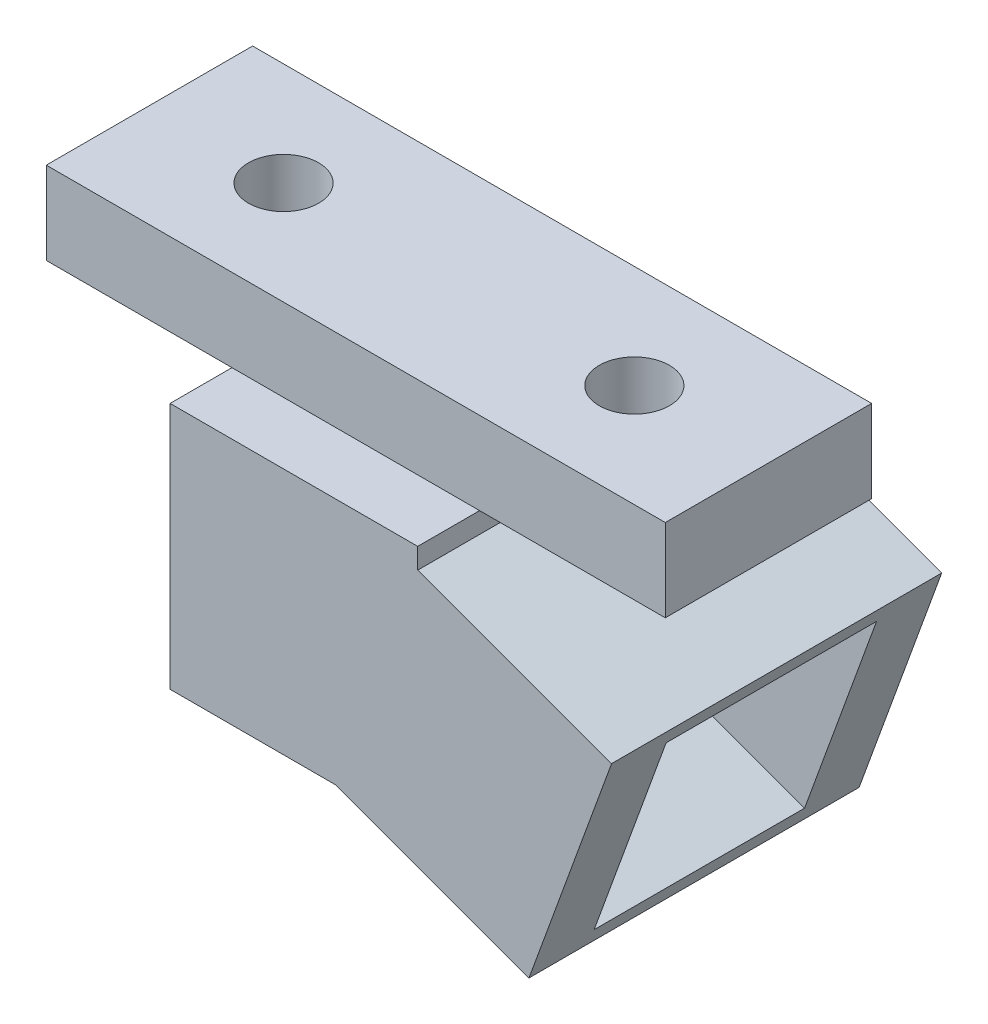
ISO-10303-21;
HEADER;
FILE_DESCRIPTION(('STEP AP214'),'2;1');
FILE_NAME('part.step','',(''),(''),'','','');
FILE_SCHEMA(('AUTOMOTIVE_DESIGN { 1 0 10303 214 1 1 1 1 }'));
ENDSEC;
DATA;
#1=APPLICATION_CONTEXT('core data for automotive mechanical design processes');
#2=APPLICATION_PROTOCOL_DEFINITION('international standard','automotive_design',2000,#1);
#3=PRODUCT_CONTEXT('',#1,'mechanical');
#4=PRODUCT('Part','Part','',(#3));
#5=PRODUCT_RELATED_PRODUCT_CATEGORY('part','',(#4));
#6=PRODUCT_DEFINITION_FORMATION('','',#4);
#7=PRODUCT_DEFINITION_CONTEXT('part definition',#1,'design');
#8=PRODUCT_DEFINITION('design','',#6,#7);
#9=PRODUCT_DEFINITION_SHAPE('','',#8);
#10=(LENGTH_UNIT() NAMED_UNIT(*) SI_UNIT(.MILLI.,.METRE.));
#11=(NAMED_UNIT(*) PLANE_ANGLE_UNIT() SI_UNIT($,.RADIAN.));
#12=(NAMED_UNIT(*) SI_UNIT($,.STERADIAN.) SOLID_ANGLE_UNIT());
#13=UNCERTAINTY_MEASURE_WITH_UNIT(LENGTH_MEASURE(1.E-05),#10,'distance_accuracy_value','');
#14=(GEOMETRIC_REPRESENTATION_CONTEXT(3) GLOBAL_UNCERTAINTY_ASSIGNED_CONTEXT((#13)) GLOBAL_UNIT_ASSIGNED_CONTEXT((#10,
#11,#12)) REPRESENTATION_CONTEXT('',''));
#15=CARTESIAN_POINT('',(0.,0.,0.));
#16=DIRECTION('',(0.,0.,1.));
#17=DIRECTION('',(1.,0.,0.));
#18=AXIS2_PLACEMENT_3D('',#15,#16,#17);
#19=CARTESIAN_POINT('',(0.,0.,0.));
#20=DIRECTION('',(0.,1.,0.));
#21=DIRECTION('',(0.,0.,1.));
#22=AXIS2_PLACEMENT_3D('',#19,#20,#21);
#23=PLANE('',#22);
#24=CARTESIAN_POINT('',(3.25,0.,-2.5));
#25=DIRECTION('',(0.,1.,0.));
#26=DIRECTION('',(0.,0.,1.));
#27=AXIS2_PLACEMENT_3D('',#24,#25,#26);
#28=CIRCLE('',#27,0.85);
#29=CARTESIAN_POINT('',(3.25,0.,-1.65));
#30=VERTEX_POINT('',#29);
#31=EDGE_CURVE('E332',#30,#30,#28,.T.);
#32=ORIENTED_EDGE('',*,*,#31,.T.);
#33=EDGE_LOOP('',(#32));
#34=FACE_BOUND('',#33,.T.);
#35=DIRECTION('',(0.,0.,-1.));
#36=VECTOR('',#35,1.);
#37=CARTESIAN_POINT('',(4.5,0.,1.5));
#38=LINE('',#37,#36);
#39=CARTESIAN_POINT('',(4.5,0.,0.));
#40=VERTEX_POINT('',#39);
#41=CARTESIAN_POINT('',(4.5,0.,-5.));
#42=VERTEX_POINT('',#41);
#43=EDGE_CURVE('E12',#40,#42,#38,.T.);
#44=ORIENTED_EDGE('',*,*,#43,.F.);
#45=DIRECTION('',(1.,0.,0.));
#46=VECTOR('',#45,1.);
#47=CARTESIAN_POINT('',(0.,0.,0.));
#48=LINE('',#47,#46);
#49=CARTESIAN_POINT('',(0.,0.,0.));
#50=VERTEX_POINT('',#49);
#51=EDGE_CURVE('E368',#50,#40,#48,.T.);
#52=ORIENTED_EDGE('',*,*,#51,.F.);
#53=DIRECTION('',(0.,0.,-1.));
#54=VECTOR('',#53,1.);
#55=CARTESIAN_POINT('',(0.,0.,0.));
#56=LINE('',#55,#54);
#57=CARTESIAN_POINT('',(0.,0.,-5.));
#58=VERTEX_POINT('',#57);
#59=EDGE_CURVE('E349',#50,#58,#56,.T.);
#60=ORIENTED_EDGE('',*,*,#59,.T.);
#61=DIRECTION('',(1.,0.,0.));
#62=VECTOR('',#61,1.);
#63=CARTESIAN_POINT('',(0.,0.,-5.));
#64=LINE('',#63,#62);
#65=EDGE_CURVE('E359',#58,#42,#64,.T.);
#66=ORIENTED_EDGE('',*,*,#65,.T.);
#67=EDGE_LOOP('',(#44,#52,#60,#66));
#68=FACE_BOUND('',#67,.T.);
#69=ADVANCED_FACE('F77',(#34,#68),#23,.F.);
#70=CARTESIAN_POINT('',(11.75,0.,-2.5));
#71=DIRECTION('',(0.,-1.,0.));
#72=DIRECTION('',(0.,0.,-1.));
#73=AXIS2_PLACEMENT_3D('',#70,#71,#72);
#74=CIRCLE('',#73,0.85);
#75=CARTESIAN_POINT('',(11.75,0.,-3.35));
#76=VERTEX_POINT('',#75);
#77=EDGE_CURVE('E327',#76,#76,#74,.T.);
#78=ORIENTED_EDGE('',*,*,#77,.F.);
#79=EDGE_LOOP('',(#78));
#80=FACE_BOUND('',#79,.T.);
#81=DIRECTION('',(0.,0.,1.));
#82=VECTOR('',#81,1.);
#83=CARTESIAN_POINT('',(10.5,0.,1.5));
#84=LINE('',#83,#82);
#85=CARTESIAN_POINT('',(10.5,0.,-5.));
#86=VERTEX_POINT('',#85);
#87=CARTESIAN_POINT('',(10.5,0.,0.));
#88=VERTEX_POINT('',#87);
#89=EDGE_CURVE('E87',#86,#88,#84,.T.);
#90=ORIENTED_EDGE('',*,*,#89,.F.);
#91=CARTESIAN_POINT('',(15.,0.,-5.));
#92=VERTEX_POINT('',#91);
#93=EDGE_CURVE('E340',#86,#92,#64,.T.);
#94=ORIENTED_EDGE('',*,*,#93,.T.);
#95=DIRECTION('',(0.,0.,-1.));
#96=VECTOR('',#95,1.);
#97=CARTESIAN_POINT('',(15.,0.,0.));
#98=LINE('',#97,#96);
#99=CARTESIAN_POINT('',(15.,0.,0.));
#100=VERTEX_POINT('',#99);
#101=EDGE_CURVE('E362',#100,#92,#98,.T.);
#102=ORIENTED_EDGE('',*,*,#101,.F.);
#103=EDGE_CURVE('E367',#88,#100,#48,.T.);
#104=ORIENTED_EDGE('',*,*,#103,.F.);
#105=EDGE_LOOP('',(#90,#94,#102,#104));
#106=FACE_BOUND('',#105,.T.);
#107=ADVANCED_FACE('F395',(#80,#106),#23,.F.);
#108=CARTESIAN_POINT('',(0.,2.,0.));
#109=DIRECTION('',(0.,1.,0.));
#110=DIRECTION('',(0.,0.,1.));
#111=AXIS2_PLACEMENT_3D('',#108,#109,#110);
#112=PLANE('',#111);
#113=CARTESIAN_POINT('',(11.75,2.,-2.5));
#114=DIRECTION('',(0.,-1.,0.));
#115=DIRECTION('',(0.,0.,-1.));
#116=AXIS2_PLACEMENT_3D('',#113,#114,#115);
#117=CIRCLE('',#116,0.85);
#118=CARTESIAN_POINT('',(11.75,2.,-3.35));
#119=VERTEX_POINT('',#118);
#120=EDGE_CURVE('E328',#119,#119,#117,.T.);
#121=ORIENTED_EDGE('',*,*,#120,.T.);
#122=EDGE_LOOP('',(#121));
#123=FACE_BOUND('',#122,.T.);
#124=DIRECTION('',(1.,0.,0.));
#125=VECTOR('',#124,1.);
#126=CARTESIAN_POINT('',(0.,2.,-5.));
#127=LINE('',#126,#125);
#128=CARTESIAN_POINT('',(0.,2.,-5.));
#129=VERTEX_POINT('',#128);
#130=CARTESIAN_POINT('',(15.,2.,-5.));
#131=VERTEX_POINT('',#130);
#132=EDGE_CURVE('E344',#129,#131,#127,.T.);
#133=ORIENTED_EDGE('',*,*,#132,.F.);
#134=DIRECTION('',(0.,0.,-1.));
#135=VECTOR('',#134,1.);
#136=CARTESIAN_POINT('',(0.,2.,0.));
#137=LINE('',#136,#135);
#138=CARTESIAN_POINT('',(0.,2.,0.));
#139=VERTEX_POINT('',#138);
#140=EDGE_CURVE('E355',#139,#129,#137,.T.);
#141=ORIENTED_EDGE('',*,*,#140,.F.);
#142=DIRECTION('',(1.,0.,0.));
#143=VECTOR('',#142,1.);
#144=CARTESIAN_POINT('',(0.,2.,0.));
#145=LINE('',#144,#143);
#146=CARTESIAN_POINT('',(15.,2.,0.));
#147=VERTEX_POINT('',#146);
#148=EDGE_CURVE('E352',#139,#147,#145,.T.);
#149=ORIENTED_EDGE('',*,*,#148,.T.);
#150=DIRECTION('',(0.,0.,-1.));
#151=VECTOR('',#150,1.);
#152=CARTESIAN_POINT('',(15.,2.,0.));
#153=LINE('',#152,#151);
#154=EDGE_CURVE('E348',#147,#131,#153,.T.);
#155=ORIENTED_EDGE('',*,*,#154,.T.);
#156=EDGE_LOOP('',(#133,#141,#149,#155));
#157=FACE_BOUND('',#156,.T.);
#158=CARTESIAN_POINT('',(3.25,2.,-2.5));
#159=DIRECTION('',(0.,1.,0.));
#160=DIRECTION('',(0.,0.,1.));
#161=AXIS2_PLACEMENT_3D('',#158,#159,#160);
#162=CIRCLE('',#161,0.85);
#163=CARTESIAN_POINT('',(3.25,2.,-1.65));
#164=VERTEX_POINT('',#163);
#165=EDGE_CURVE('E336',#164,#164,#162,.T.);
#166=ORIENTED_EDGE('',*,*,#165,.F.);
#167=EDGE_LOOP('',(#166));
#168=FACE_BOUND('',#167,.T.);
#169=ADVANCED_FACE('F460',(#123,#157,#168),#112,.T.);
#170=CARTESIAN_POINT('',(0.,2.,-5.));
#171=DIRECTION('',(0.,0.,-1.));
#172=DIRECTION('',(-1.,0.,0.));
#173=AXIS2_PLACEMENT_3D('',#170,#171,#172);
#174=PLANE('',#173);
#175=ORIENTED_EDGE('',*,*,#65,.F.);
#176=DIRECTION('',(0.,-1.,0.));
#177=VECTOR('',#176,1.);
#178=CARTESIAN_POINT('',(0.,2.,-5.));
#179=LINE('',#178,#177);
#180=EDGE_CURVE('E375',#129,#58,#179,.T.);
#181=ORIENTED_EDGE('',*,*,#180,.F.);
#182=ORIENTED_EDGE('',*,*,#132,.T.);
#183=DIRECTION('',(0.,-1.,0.));
#184=VECTOR('',#183,1.);
#185=CARTESIAN_POINT('',(15.,2.,-5.));
#186=LINE('',#185,#184);
#187=EDGE_CURVE('E81',#131,#92,#186,.T.);
#188=ORIENTED_EDGE('',*,*,#187,.T.);
#189=ORIENTED_EDGE('',*,*,#93,.F.);
#190=EDGE_CURVE('E363',#42,#86,#64,.T.);
#191=ORIENTED_EDGE('',*,*,#190,.F.);
#192=EDGE_LOOP('',(#175,#181,#182,#188,#189,#191));
#193=FACE_BOUND('',#192,.T.);
#194=ADVANCED_FACE('F79',(#193),#174,.T.);
#195=CARTESIAN_POINT('',(0.,2.,0.));
#196=DIRECTION('',(-1.,0.,0.));
#197=DIRECTION('',(0.,0.,1.));
#198=AXIS2_PLACEMENT_3D('',#195,#196,#197);
#199=PLANE('',#198);
#200=ORIENTED_EDGE('',*,*,#59,.F.);
#201=DIRECTION('',(0.,-1.,0.));
#202=VECTOR('',#201,1.);
#203=CARTESIAN_POINT('',(0.,2.,0.));
#204=LINE('',#203,#202);
#205=EDGE_CURVE('E378',#139,#50,#204,.T.);
#206=ORIENTED_EDGE('',*,*,#205,.F.);
#207=ORIENTED_EDGE('',*,*,#140,.T.);
#208=ORIENTED_EDGE('',*,*,#180,.T.);
#209=EDGE_LOOP('',(#200,#206,#207,#208));
#210=FACE_BOUND('',#209,.T.);
#211=ADVANCED_FACE('F465',(#210),#199,.T.);
#212=CARTESIAN_POINT('',(0.,2.,0.));
#213=DIRECTION('',(0.,0.,-1.));
#214=DIRECTION('',(-1.,0.,0.));
#215=AXIS2_PLACEMENT_3D('',#212,#213,#214);
#216=PLANE('',#215);
#217=ORIENTED_EDGE('',*,*,#51,.T.);
#218=EDGE_CURVE('E371',#40,#88,#48,.T.);
#219=ORIENTED_EDGE('',*,*,#218,.T.);
#220=ORIENTED_EDGE('',*,*,#103,.T.);
#221=DIRECTION('',(0.,-1.,0.));
#222=VECTOR('',#221,1.);
#223=CARTESIAN_POINT('',(15.,2.,0.));
#224=LINE('',#223,#222);
#225=EDGE_CURVE('E380',#147,#100,#224,.T.);
#226=ORIENTED_EDGE('',*,*,#225,.F.);
#227=ORIENTED_EDGE('',*,*,#148,.F.);
#228=ORIENTED_EDGE('',*,*,#205,.T.);
#229=EDGE_LOOP('',(#217,#219,#220,#226,#227,#228));
#230=FACE_BOUND('',#229,.T.);
#231=ADVANCED_FACE('F468',(#230),#216,.F.);
#232=CARTESIAN_POINT('',(15.,2.,0.));
#233=DIRECTION('',(-1.,0.,0.));
#234=DIRECTION('',(0.,0.,1.));
#235=AXIS2_PLACEMENT_3D('',#232,#233,#234);
#236=PLANE('',#235);
#237=ORIENTED_EDGE('',*,*,#101,.T.);
#238=ORIENTED_EDGE('',*,*,#187,.F.);
#239=ORIENTED_EDGE('',*,*,#154,.F.);
#240=ORIENTED_EDGE('',*,*,#225,.T.);
#241=EDGE_LOOP('',(#237,#238,#239,#240));
#242=FACE_BOUND('',#241,.T.);
#243=ADVANCED_FACE('F394',(#242),#236,.F.);
#244=CARTESIAN_POINT('',(3.25,2.,-2.5));
#245=DIRECTION('',(0.,-1.,0.));
#246=DIRECTION('',(0.,0.,-1.));
#247=AXIS2_PLACEMENT_3D('',#244,#245,#246);
#248=CYLINDRICAL_SURFACE('',#247,0.85);
#249=ORIENTED_EDGE('',*,*,#165,.T.);
#250=EDGE_LOOP('',(#249));
#251=FACE_BOUND('',#250,.T.);
#252=ORIENTED_EDGE('',*,*,#31,.F.);
#253=EDGE_LOOP('',(#252));
#254=FACE_BOUND('',#253,.T.);
#255=ADVANCED_FACE('F473',(#251,#254),#248,.F.);
#256=CARTESIAN_POINT('',(11.75,2.,-2.5));
#257=DIRECTION('',(0.,-1.,0.));
#258=DIRECTION('',(0.,0.,-1.));
#259=AXIS2_PLACEMENT_3D('',#256,#257,#258);
#260=CYLINDRICAL_SURFACE('',#259,0.85);
#261=ORIENTED_EDGE('',*,*,#120,.F.);
#262=EDGE_LOOP('',(#261));
#263=FACE_BOUND('',#262,.T.);
#264=ORIENTED_EDGE('',*,*,#77,.T.);
#265=EDGE_LOOP('',(#264));
#266=FACE_BOUND('',#265,.T.);
#267=ADVANCED_FACE('F477',(#263,#266),#260,.F.);
#268=CARTESIAN_POINT('',(0.,0.,0.));
#269=DIRECTION('',(0.,-1.,0.));
#270=DIRECTION('',(0.,0.,-1.));
#271=AXIS2_PLACEMENT_3D('',#268,#269,#270);
#272=PLANE('',#271);
#273=CARTESIAN_POINT('',(4.5,0.,-6.5));
#274=VERTEX_POINT('',#273);
#275=EDGE_CURVE('E90',#42,#274,#38,.T.);
#276=ORIENTED_EDGE('',*,*,#275,.F.);
#277=ORIENTED_EDGE('',*,*,#190,.T.);
#278=CARTESIAN_POINT('',(10.5,0.,-6.5));
#279=VERTEX_POINT('',#278);
#280=EDGE_CURVE('E305',#279,#86,#84,.T.);
#281=ORIENTED_EDGE('',*,*,#280,.F.);
#282=DIRECTION('',(1.,0.,0.));
#283=VECTOR('',#282,1.);
#284=CARTESIAN_POINT('',(10.5,0.,-6.5));
#285=LINE('',#284,#283);
#286=EDGE_CURVE('E286',#274,#279,#285,.T.);
#287=ORIENTED_EDGE('',*,*,#286,.F.);
#288=EDGE_LOOP('',(#276,#277,#281,#287));
#289=FACE_BOUND('',#288,.T.);
#290=ADVANCED_FACE('F402',(#289),#272,.F.);
#291=CARTESIAN_POINT('',(10.5,-6.,-6.5));
#292=DIRECTION('',(0.,0.,1.));
#293=DIRECTION('',(1.,0.,0.));
#294=AXIS2_PLACEMENT_3D('',#291,#292,#293);
#295=PLANE('',#294);
#296=DIRECTION('',(0.,1.,0.));
#297=VECTOR('',#296,1.);
#298=CARTESIAN_POINT('',(10.5,-6.,-6.5));
#299=LINE('',#298,#297);
#300=CARTESIAN_POINT('',(10.5,-0.5,-6.5));
#301=VERTEX_POINT('',#300);
#302=EDGE_CURVE('E324',#301,#279,#299,.T.);
#303=ORIENTED_EDGE('',*,*,#302,.F.);
#304=DIRECTION('',(-0.93969262078591,0.342020143325663,0.));
#305=VECTOR('',#304,1.);
#306=CARTESIAN_POINT('',(15.1984631039296,-2.21010071662832,-6.5));
#307=LINE('',#306,#305);
#308=CARTESIAN_POINT('',(15.1984631039296,-2.21010071662832,-6.5));
#309=VERTEX_POINT('',#308);
#310=EDGE_CURVE('E253',#309,#301,#307,.T.);
#311=ORIENTED_EDGE('',*,*,#310,.F.);
#312=DIRECTION('',(0.342020143325663,0.939692620785911,0.));
#313=VECTOR('',#312,1.);
#314=CARTESIAN_POINT('',(15.1984631039296,-2.21010071662832,-6.5));
#315=LINE('',#314,#313);
#316=CARTESIAN_POINT('',(13.1966268154655,-7.71010071662832,-6.5));
#317=VERTEX_POINT('',#316);
#318=EDGE_CURVE('E243',#317,#309,#315,.T.);
#319=ORIENTED_EDGE('',*,*,#318,.F.);
#320=DIRECTION('',(-0.93969262078591,0.342020143325663,0.));
#321=VECTOR('',#320,1.);
#322=CARTESIAN_POINT('',(13.1966268154655,-7.71010071662832,-6.5));
#323=LINE('',#322,#321);
#324=CARTESIAN_POINT('',(8.49816371153593,-6.,-6.5));
#325=VERTEX_POINT('',#324);
#326=EDGE_CURVE('E256',#317,#325,#323,.T.);
#327=ORIENTED_EDGE('',*,*,#326,.T.);
#328=DIRECTION('',(1.,0.,0.));
#329=VECTOR('',#328,1.);
#330=CARTESIAN_POINT('',(10.5,-6.,-6.5));
#331=LINE('',#330,#329);
#332=CARTESIAN_POINT('',(4.5,-6.,-6.5));
#333=VERTEX_POINT('',#332);
#334=EDGE_CURVE('E290',#333,#325,#331,.T.);
#335=ORIENTED_EDGE('',*,*,#334,.F.);
#336=DIRECTION('',(0.,1.,0.));
#337=VECTOR('',#336,1.);
#338=CARTESIAN_POINT('',(4.5,-6.,-6.5));
#339=LINE('',#338,#337);
#340=EDGE_CURVE('E300',#333,#274,#339,.T.);
#341=ORIENTED_EDGE('',*,*,#340,.T.);
#342=ORIENTED_EDGE('',*,*,#286,.T.);
#343=EDGE_LOOP('',(#303,#311,#319,#327,#335,#341,#342));
#344=FACE_BOUND('',#343,.T.);
#345=ADVANCED_FACE('F411',(#344),#295,.F.);
#346=CARTESIAN_POINT('',(10.5,-6.,1.5));
#347=DIRECTION('',(-1.,0.,0.));
#348=DIRECTION('',(0.,0.,1.));
#349=AXIS2_PLACEMENT_3D('',#346,#347,#348);
#350=PLANE('',#349);
#351=DIRECTION('',(0.,1.,0.));
#352=VECTOR('',#351,1.);
#353=CARTESIAN_POINT('',(10.5,-6.,1.5));
#354=LINE('',#353,#352);
#355=CARTESIAN_POINT('',(10.5,-0.500000000000003,1.5));
#356=VERTEX_POINT('',#355);
#357=CARTESIAN_POINT('',(10.5,0.,1.5));
#358=VERTEX_POINT('',#357);
#359=EDGE_CURVE('E321',#356,#358,#354,.T.);
#360=ORIENTED_EDGE('',*,*,#359,.F.);
#361=DIRECTION('',(0.,0.,-1.));
#362=VECTOR('',#361,1.);
#363=CARTESIAN_POINT('',(10.5,-0.5,7.3529777486175));
#364=LINE('',#363,#362);
#365=EDGE_CURVE('E277',#356,#301,#364,.T.);
#366=ORIENTED_EDGE('',*,*,#365,.T.);
#367=ORIENTED_EDGE('',*,*,#302,.T.);
#368=ORIENTED_EDGE('',*,*,#280,.T.);
#369=ORIENTED_EDGE('',*,*,#89,.T.);
#370=EDGE_CURVE('E304',#88,#358,#84,.T.);
#371=ORIENTED_EDGE('',*,*,#370,.T.);
#372=EDGE_LOOP('',(#360,#366,#367,#368,#369,#371));
#373=FACE_BOUND('',#372,.T.);
#374=ADVANCED_FACE('F406',(#373),#350,.F.);
#375=CARTESIAN_POINT('',(10.5,-6.,1.5));
#376=DIRECTION('',(0.,0.,-1.));
#377=DIRECTION('',(-1.,0.,0.));
#378=AXIS2_PLACEMENT_3D('',#375,#376,#377);
#379=PLANE('',#378);
#380=DIRECTION('',(-1.,0.,0.));
#381=VECTOR('',#380,1.);
#382=CARTESIAN_POINT('',(10.5,-6.,1.5));
#383=LINE('',#382,#381);
#384=CARTESIAN_POINT('',(8.49816371153593,-6.,1.5));
#385=VERTEX_POINT('',#384);
#386=CARTESIAN_POINT('',(4.5,-6.,1.5));
#387=VERTEX_POINT('',#386);
#388=EDGE_CURVE('E294',#385,#387,#383,.T.);
#389=ORIENTED_EDGE('',*,*,#388,.F.);
#390=DIRECTION('',(-0.93969262078591,0.342020143325663,0.));
#391=VECTOR('',#390,1.);
#392=CARTESIAN_POINT('',(13.1966268154655,-7.71010071662832,1.5));
#393=LINE('',#392,#391);
#394=CARTESIAN_POINT('',(13.1966268154655,-7.71010071662832,1.5));
#395=VERTEX_POINT('',#394);
#396=EDGE_CURVE('E260',#395,#385,#393,.T.);
#397=ORIENTED_EDGE('',*,*,#396,.F.);
#398=DIRECTION('',(-0.342020143325663,-0.93969262078591,0.));
#399=VECTOR('',#398,1.);
#400=CARTESIAN_POINT('',(15.1984631039296,-2.21010071662832,1.5));
#401=LINE('',#400,#399);
#402=CARTESIAN_POINT('',(15.1984631039296,-2.21010071662832,1.5));
#403=VERTEX_POINT('',#402);
#404=EDGE_CURVE('E236',#403,#395,#401,.T.);
#405=ORIENTED_EDGE('',*,*,#404,.F.);
#406=DIRECTION('',(-0.93969262078591,0.342020143325663,0.));
#407=VECTOR('',#406,1.);
#408=CARTESIAN_POINT('',(15.1984631039296,-2.21010071662832,1.5));
#409=LINE('',#408,#407);
#410=EDGE_CURVE('E249',#403,#356,#409,.T.);
#411=ORIENTED_EDGE('',*,*,#410,.T.);
#412=ORIENTED_EDGE('',*,*,#359,.T.);
#413=DIRECTION('',(-1.,0.,0.));
#414=VECTOR('',#413,1.);
#415=CARTESIAN_POINT('',(10.5,0.,1.5));
#416=LINE('',#415,#414);
#417=CARTESIAN_POINT('',(4.5,0.,1.5));
#418=VERTEX_POINT('',#417);
#419=EDGE_CURVE('E309',#358,#418,#416,.T.);
#420=ORIENTED_EDGE('',*,*,#419,.T.);
#421=DIRECTION('',(0.,1.,0.));
#422=VECTOR('',#421,1.);
#423=CARTESIAN_POINT('',(4.5,-6.,1.5));
#424=LINE('',#423,#422);
#425=EDGE_CURVE('E317',#387,#418,#424,.T.);
#426=ORIENTED_EDGE('',*,*,#425,.F.);
#427=EDGE_LOOP('',(#389,#397,#405,#411,#412,#420,#426));
#428=FACE_BOUND('',#427,.T.);
#429=ADVANCED_FACE('F430',(#428),#379,.F.);
#430=CARTESIAN_POINT('',(4.5,-6.,1.5));
#431=DIRECTION('',(1.,0.,0.));
#432=DIRECTION('',(0.,0.,-1.));
#433=AXIS2_PLACEMENT_3D('',#430,#431,#432);
#434=PLANE('',#433);
#435=EDGE_CURVE('E89',#418,#40,#38,.T.);
#436=ORIENTED_EDGE('',*,*,#435,.T.);
#437=ORIENTED_EDGE('',*,*,#43,.T.);
#438=ORIENTED_EDGE('',*,*,#275,.T.);
#439=ORIENTED_EDGE('',*,*,#340,.F.);
#440=DIRECTION('',(0.,0.,-1.));
#441=VECTOR('',#440,1.);
#442=CARTESIAN_POINT('',(4.5,-6.,1.5));
#443=LINE('',#442,#441);
#444=EDGE_CURVE('E297',#387,#333,#443,.T.);
#445=ORIENTED_EDGE('',*,*,#444,.F.);
#446=ORIENTED_EDGE('',*,*,#425,.T.);
#447=EDGE_LOOP('',(#436,#437,#438,#439,#445,#446));
#448=FACE_BOUND('',#447,.T.);
#449=ADVANCED_FACE('F418',(#448),#434,.F.);
#450=CARTESIAN_POINT('',(0.,-6.,0.));
#451=DIRECTION('',(0.,-1.,0.));
#452=DIRECTION('',(0.,0.,-1.));
#453=AXIS2_PLACEMENT_3D('',#450,#451,#452);
#454=PLANE('',#453);
#455=DIRECTION('',(0.,0.,-1.));
#456=VECTOR('',#455,1.);
#457=CARTESIAN_POINT('',(8.49816371153592,-6.,7.3529777486175));
#458=LINE('',#457,#456);
#459=EDGE_CURVE('E283',#385,#325,#458,.T.);
#460=ORIENTED_EDGE('',*,*,#459,.F.);
#461=ORIENTED_EDGE('',*,*,#388,.T.);
#462=ORIENTED_EDGE('',*,*,#444,.T.);
#463=ORIENTED_EDGE('',*,*,#334,.T.);
#464=EDGE_LOOP('',(#460,#461,#462,#463));
#465=FACE_BOUND('',#464,.T.);
#466=ADVANCED_FACE('F441',(#465),#454,.T.);
#467=ORIENTED_EDGE('',*,*,#218,.F.);
#468=ORIENTED_EDGE('',*,*,#435,.F.);
#469=ORIENTED_EDGE('',*,*,#419,.F.);
#470=ORIENTED_EDGE('',*,*,#370,.F.);
#471=EDGE_LOOP('',(#467,#468,#469,#470));
#472=FACE_BOUND('',#471,.T.);
#473=ADVANCED_FACE('F426',(#472),#272,.F.);
#474=CARTESIAN_POINT('',(14.1308933327259,-5.14322455670285,0.));
#475=DIRECTION('',(0.93969262078591,-0.342020143325663,0.));
#476=DIRECTION('',(0.342020143325663,0.93969262078591,0.));
#477=AXIS2_PLACEMENT_3D('',#474,#475,#476);
#478=PLANE('',#477);
#479=ORIENTED_EDGE('',*,*,#404,.T.);
#480=DIRECTION('',(0.,0.,-1.));
#481=VECTOR('',#480,1.);
#482=CARTESIAN_POINT('',(13.1966268154655,-7.71010071662832,1.5));
#483=LINE('',#482,#481);
#484=EDGE_CURVE('E240',#395,#317,#483,.T.);
#485=ORIENTED_EDGE('',*,*,#484,.T.);
#486=ORIENTED_EDGE('',*,*,#318,.T.);
#487=DIRECTION('',(0.,0.,1.));
#488=VECTOR('',#487,1.);
#489=CARTESIAN_POINT('',(15.1984631039296,-2.21010071662832,1.5));
#490=LINE('',#489,#488);
#491=EDGE_CURVE('E246',#309,#403,#490,.T.);
#492=ORIENTED_EDGE('',*,*,#491,.T.);
#493=EDGE_LOOP('',(#479,#485,#486,#492));
#494=FACE_BOUND('',#493,.T.);
#495=DIRECTION('',(0.,0.,-1.));
#496=VECTOR('',#495,1.);
#497=CARTESIAN_POINT('',(13.3253935942171,-7.35631689963239,0.0500000000000049));
#498=LINE('',#497,#496);
#499=CARTESIAN_POINT('',(13.3253935942171,-7.35631689963239,0.0500000000000049));
#500=VERTEX_POINT('',#499);
#501=CARTESIAN_POINT('',(13.3253935942171,-7.35631689963239,-5.05));
#502=VERTEX_POINT('',#501);
#503=EDGE_CURVE('E205',#500,#502,#498,.T.);
#504=ORIENTED_EDGE('',*,*,#503,.F.);
#505=DIRECTION('',(-0.342020143325663,-0.93969262078591,0.));
#506=VECTOR('',#505,1.);
#507=CARTESIAN_POINT('',(15.069696325178,-2.56388453362425,0.0500000000000053));
#508=LINE('',#507,#506);
#509=CARTESIAN_POINT('',(15.069696325178,-2.56388453362425,0.0500000000000053));
#510=VERTEX_POINT('',#509);
#511=EDGE_CURVE('E217',#510,#500,#508,.T.);
#512=ORIENTED_EDGE('',*,*,#511,.F.);
#513=DIRECTION('',(0.,0.,1.));
#514=VECTOR('',#513,1.);
#515=CARTESIAN_POINT('',(15.069696325178,-2.56388453362425,0.0500000000000053));
#516=LINE('',#515,#514);
#517=CARTESIAN_POINT('',(15.069696325178,-2.56388453362425,-5.04999999999999));
#518=VERTEX_POINT('',#517);
#519=EDGE_CURVE('E231',#518,#510,#516,.T.);
#520=ORIENTED_EDGE('',*,*,#519,.F.);
#521=DIRECTION('',(0.342020143325663,0.939692620785911,0.));
#522=VECTOR('',#521,1.);
#523=CARTESIAN_POINT('',(15.069696325178,-2.56388453362425,-5.04999999999999));
#524=LINE('',#523,#522);
#525=EDGE_CURVE('E227',#502,#518,#524,.T.);
#526=ORIENTED_EDGE('',*,*,#525,.F.);
#527=EDGE_LOOP('',(#504,#512,#520,#526));
#528=FACE_BOUND('',#527,.T.);
#529=ADVANCED_FACE('F225',(#494,#528),#478,.T.);
#530=CARTESIAN_POINT('',(13.1966268154655,-7.71010071662832,1.5));
#531=DIRECTION('',(0.342020143325663,0.93969262078591,0.));
#532=DIRECTION('',(-0.93969262078591,0.342020143325663,0.));
#533=AXIS2_PLACEMENT_3D('',#530,#531,#532);
#534=PLANE('',#533);
#535=ORIENTED_EDGE('',*,*,#459,.T.);
#536=ORIENTED_EDGE('',*,*,#326,.F.);
#537=ORIENTED_EDGE('',*,*,#484,.F.);
#538=ORIENTED_EDGE('',*,*,#396,.T.);
#539=EDGE_LOOP('',(#535,#536,#537,#538));
#540=FACE_BOUND('',#539,.T.);
#541=ADVANCED_FACE('F442',(#540),#534,.F.);
#542=CARTESIAN_POINT('',(15.1984631039296,-2.21010071662832,1.5));
#543=DIRECTION('',(-0.342020143325663,-0.93969262078591,0.));
#544=DIRECTION('',(0.93969262078591,-0.342020143325663,0.));
#545=AXIS2_PLACEMENT_3D('',#542,#543,#544);
#546=PLANE('',#545);
#547=ORIENTED_EDGE('',*,*,#365,.F.);
#548=ORIENTED_EDGE('',*,*,#410,.F.);
#549=ORIENTED_EDGE('',*,*,#491,.F.);
#550=ORIENTED_EDGE('',*,*,#310,.T.);
#551=EDGE_LOOP('',(#547,#548,#549,#550));
#552=FACE_BOUND('',#551,.T.);
#553=ADVANCED_FACE('F435',(#552),#546,.F.);
#554=CARTESIAN_POINT('',(7.55304498722449,-2.74908355342321,0.));
#555=DIRECTION('',(-0.93969262078591,0.342020143325663,0.));
#556=DIRECTION('',(-0.342020143325663,-0.93969262078591,0.));
#557=AXIS2_PLACEMENT_3D('',#554,#555,#556);
#558=PLANE('',#557);
#559=DIRECTION('',(-0.342020143325663,-0.93969262078591,0.));
#560=VECTOR('',#559,1.);
#561=CARTESIAN_POINT('',(8.49184797967659,-0.169743530344604,0.0500000000000043));
#562=LINE('',#561,#560);
#563=CARTESIAN_POINT('',(8.49184797967659,-0.169743530344604,0.0500000000000043));
#564=VERTEX_POINT('',#563);
#565=CARTESIAN_POINT('',(6.7475452487157,-4.96217589635275,0.05));
#566=VERTEX_POINT('',#565);
#567=EDGE_CURVE('E263',#564,#566,#562,.T.);
#568=ORIENTED_EDGE('',*,*,#567,.T.);
#569=DIRECTION('',(0.,0.,-1.));
#570=VECTOR('',#569,1.);
#571=CARTESIAN_POINT('',(6.74754524871571,-4.96217589635274,-5.05));
#572=LINE('',#571,#570);
#573=CARTESIAN_POINT('',(6.74754524871571,-4.96217589635274,-5.05));
#574=VERTEX_POINT('',#573);
#575=EDGE_CURVE('E208',#566,#574,#572,.T.);
#576=ORIENTED_EDGE('',*,*,#575,.T.);
#577=DIRECTION('',(0.342020143325663,0.93969262078591,0.));
#578=VECTOR('',#577,1.);
#579=CARTESIAN_POINT('',(8.49184797967659,-0.1697435303446,-5.04999999999999));
#580=LINE('',#579,#578);
#581=CARTESIAN_POINT('',(8.49184797967659,-0.1697435303446,-5.04999999999999));
#582=VERTEX_POINT('',#581);
#583=EDGE_CURVE('E268',#574,#582,#580,.T.);
#584=ORIENTED_EDGE('',*,*,#583,.T.);
#585=DIRECTION('',(0.,0.,1.));
#586=VECTOR('',#585,1.);
#587=CARTESIAN_POINT('',(8.49184797967659,-0.1697435303446,-5.04999999999999));
#588=LINE('',#587,#586);
#589=EDGE_CURVE('E214',#582,#564,#588,.T.);
#590=ORIENTED_EDGE('',*,*,#589,.T.);
#591=EDGE_LOOP('',(#568,#576,#584,#590));
#592=FACE_BOUND('',#591,.T.);
#593=ADVANCED_FACE('F449',(#592),#558,.F.);
#594=CARTESIAN_POINT('',(8.49184797967659,-0.1697435303446,-5.04999999999999));
#595=DIRECTION('',(0.,0.,-1.));
#596=DIRECTION('',(0.,1.,0.));
#597=AXIS2_PLACEMENT_3D('',#594,#595,#596);
#598=PLANE('',#597);
#599=DIRECTION('',(0.93969262078591,-0.342020143325663,0.));
#600=VECTOR('',#599,1.);
#601=CARTESIAN_POINT('',(6.74754524871571,-4.96217589635274,-5.05));
#602=LINE('',#601,#600);
#603=EDGE_CURVE('E213',#574,#502,#602,.T.);
#604=ORIENTED_EDGE('',*,*,#603,.T.);
#605=ORIENTED_EDGE('',*,*,#525,.T.);
#606=DIRECTION('',(0.93969262078591,-0.342020143325663,0.));
#607=VECTOR('',#606,1.);
#608=CARTESIAN_POINT('',(8.49184797967659,-0.1697435303446,-5.04999999999999));
#609=LINE('',#608,#607);
#610=EDGE_CURVE('E278',#582,#518,#609,.T.);
#611=ORIENTED_EDGE('',*,*,#610,.F.);
#612=ORIENTED_EDGE('',*,*,#583,.F.);
#613=EDGE_LOOP('',(#604,#605,#611,#612));
#614=FACE_BOUND('',#613,.T.);
#615=ADVANCED_FACE('F502',(#614),#598,.F.);
#616=CARTESIAN_POINT('',(8.49184797967659,-0.1697435303446,-5.04999999999999));
#617=DIRECTION('',(0.342020143325663,0.93969262078591,0.));
#618=DIRECTION('',(-0.93969262078591,0.342020143325663,0.));
#619=AXIS2_PLACEMENT_3D('',#616,#617,#618);
#620=PLANE('',#619);
#621=ORIENTED_EDGE('',*,*,#610,.T.);
#622=ORIENTED_EDGE('',*,*,#519,.T.);
#623=DIRECTION('',(0.93969262078591,-0.342020143325663,0.));
#624=VECTOR('',#623,1.);
#625=CARTESIAN_POINT('',(8.49184797967659,-0.169743530344604,0.0500000000000043));
#626=LINE('',#625,#624);
#627=EDGE_CURVE('E219',#564,#510,#626,.T.);
#628=ORIENTED_EDGE('',*,*,#627,.F.);
#629=ORIENTED_EDGE('',*,*,#589,.F.);
#630=EDGE_LOOP('',(#621,#622,#628,#629));
#631=FACE_BOUND('',#630,.T.);
#632=ADVANCED_FACE('F499',(#631),#620,.F.);
#633=CARTESIAN_POINT('',(8.49184797967659,-0.169743530344604,0.0500000000000043));
#634=DIRECTION('',(0.,0.,1.));
#635=DIRECTION('',(0.,-1.,0.));
#636=AXIS2_PLACEMENT_3D('',#633,#634,#635);
#637=PLANE('',#636);
#638=ORIENTED_EDGE('',*,*,#627,.T.);
#639=ORIENTED_EDGE('',*,*,#511,.T.);
#640=DIRECTION('',(0.93969262078591,-0.342020143325663,0.));
#641=VECTOR('',#640,1.);
#642=CARTESIAN_POINT('',(6.7475452487157,-4.96217589635275,0.05));
#643=LINE('',#642,#641);
#644=EDGE_CURVE('E201',#566,#500,#643,.T.);
#645=ORIENTED_EDGE('',*,*,#644,.F.);
#646=ORIENTED_EDGE('',*,*,#567,.F.);
#647=EDGE_LOOP('',(#638,#639,#645,#646));
#648=FACE_BOUND('',#647,.T.);
#649=ADVANCED_FACE('F218',(#648),#637,.F.);
#650=CARTESIAN_POINT('',(6.74754524871571,-4.96217589635274,-5.05));
#651=DIRECTION('',(-0.342020143325663,-0.93969262078591,0.));
#652=DIRECTION('',(0.93969262078591,-0.342020143325663,0.));
#653=AXIS2_PLACEMENT_3D('',#650,#651,#652);
#654=PLANE('',#653);
#655=ORIENTED_EDGE('',*,*,#644,.T.);
#656=ORIENTED_EDGE('',*,*,#503,.T.);
#657=ORIENTED_EDGE('',*,*,#603,.F.);
#658=ORIENTED_EDGE('',*,*,#575,.F.);
#659=EDGE_LOOP('',(#655,#656,#657,#658));
#660=FACE_BOUND('',#659,.T.);
#661=ADVANCED_FACE('F203',(#660),#654,.F.);
#662=CLOSED_SHELL('',(#69,#107,#169,#194,#211,#231,#243,#255,#267,#290,#345,#374,#429,#449,#466,
#473,#529,#541,#553,#593,#615,#632,#649,#661));
#663=MANIFOLD_SOLID_BREP('B2',#662);
#664=ADVANCED_BREP_SHAPE_REPRESENTATION('',(#18,#663),#14);
#665=SHAPE_DEFINITION_REPRESENTATION(#9,#664);
ENDSEC;
END-ISO-10303-21;
